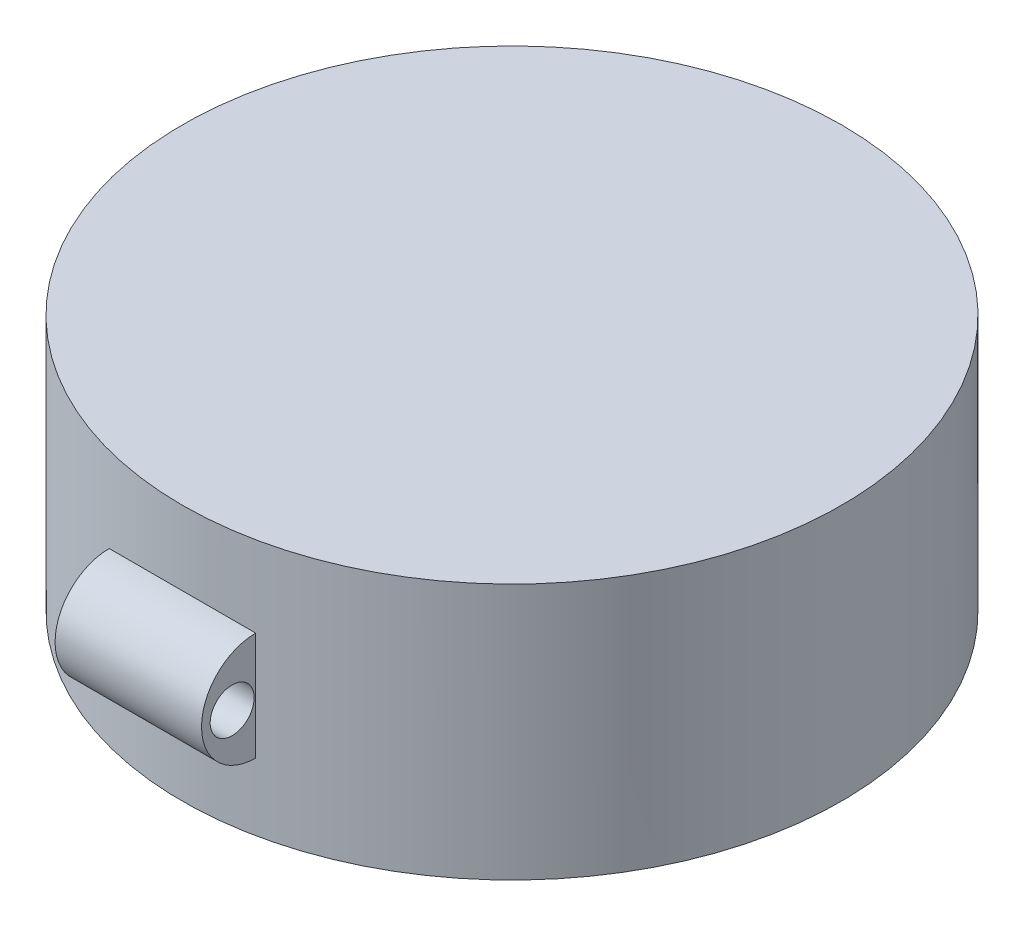
ISO-10303-21;
HEADER;
FILE_DESCRIPTION(('STEP AP214'),'2;1');
FILE_NAME('part.step','',(''),(''),'','','');
FILE_SCHEMA(('AUTOMOTIVE_DESIGN { 1 0 10303 214 1 1 1 1 }'));
ENDSEC;
DATA;
#1=APPLICATION_CONTEXT('core data for automotive mechanical design processes');
#2=APPLICATION_PROTOCOL_DEFINITION('international standard','automotive_design',2000,#1);
#3=PRODUCT_CONTEXT('',#1,'mechanical');
#4=PRODUCT('Part','Part','',(#3));
#5=PRODUCT_RELATED_PRODUCT_CATEGORY('part','',(#4));
#6=PRODUCT_DEFINITION_FORMATION('','',#4);
#7=PRODUCT_DEFINITION_CONTEXT('part definition',#1,'design');
#8=PRODUCT_DEFINITION('design','',#6,#7);
#9=PRODUCT_DEFINITION_SHAPE('','',#8);
#10=(LENGTH_UNIT() NAMED_UNIT(*) SI_UNIT(.MILLI.,.METRE.));
#11=(NAMED_UNIT(*) PLANE_ANGLE_UNIT() SI_UNIT($,.RADIAN.));
#12=(NAMED_UNIT(*) SI_UNIT($,.STERADIAN.) SOLID_ANGLE_UNIT());
#13=UNCERTAINTY_MEASURE_WITH_UNIT(LENGTH_MEASURE(1.E-05),#10,'distance_accuracy_value','');
#14=(GEOMETRIC_REPRESENTATION_CONTEXT(3) GLOBAL_UNCERTAINTY_ASSIGNED_CONTEXT((#13)) GLOBAL_UNIT_ASSIGNED_CONTEXT((#10,
#11,#12)) REPRESENTATION_CONTEXT('',''));
#15=CARTESIAN_POINT('',(0.,0.,0.));
#16=DIRECTION('',(0.,0.,1.));
#17=DIRECTION('',(1.,0.,0.));
#18=AXIS2_PLACEMENT_3D('',#15,#16,#17);
#19=CARTESIAN_POINT('',(10.,2.5,45.));
#20=DIRECTION('',(-1.,0.,0.));
#21=DIRECTION('',(0.,0.,1.));
#22=AXIS2_PLACEMENT_3D('',#19,#20,#21);
#23=CYLINDRICAL_SURFACE('',#22,7.39009012205296);
#24=CARTESIAN_POINT('',(-10.,2.5,45.));
#25=DIRECTION('',(-1.,0.,0.));
#26=DIRECTION('',(0.,0.,1.));
#27=AXIS2_PLACEMENT_3D('',#24,#25,#26);
#28=CIRCLE('',#27,7.39009012205296);
#29=CARTESIAN_POINT('',(-10.,-4.89009012205297,45.));
#30=VERTEX_POINT('',#29);
#31=CARTESIAN_POINT('',(-10.,9.89009012205296,45.));
#32=VERTEX_POINT('',#31);
#33=EDGE_CURVE('E12',#30,#32,#28,.T.);
#34=ORIENTED_EDGE('',*,*,#33,.F.);
#35=DIRECTION('',(-1.,0.,0.));
#36=VECTOR('',#35,1.);
#37=CARTESIAN_POINT('',(10.,-4.89009012205297,45.));
#38=LINE('',#37,#36);
#39=CARTESIAN_POINT('',(10.,-4.89009012205297,45.));
#40=VERTEX_POINT('',#39);
#41=EDGE_CURVE('E76',#40,#30,#38,.T.);
#42=ORIENTED_EDGE('',*,*,#41,.F.);
#43=CARTESIAN_POINT('',(10.,2.5,45.));
#44=DIRECTION('',(-1.,0.,0.));
#45=DIRECTION('',(0.,0.,1.));
#46=AXIS2_PLACEMENT_3D('',#43,#44,#45);
#47=CIRCLE('',#46,7.39009012205296);
#48=CARTESIAN_POINT('',(10.,9.89009012205296,45.));
#49=VERTEX_POINT('',#48);
#50=EDGE_CURVE('E56',#40,#49,#47,.T.);
#51=ORIENTED_EDGE('',*,*,#50,.T.);
#52=DIRECTION('',(-1.,0.,0.));
#53=VECTOR('',#52,1.);
#54=CARTESIAN_POINT('',(10.,9.89009012205296,45.));
#55=LINE('',#54,#53);
#56=EDGE_CURVE('E71',#49,#32,#55,.T.);
#57=ORIENTED_EDGE('',*,*,#56,.T.);
#58=EDGE_LOOP('',(#34,#42,#51,#57));
#59=FACE_BOUND('',#58,.T.);
#60=ADVANCED_FACE('F52',(#59),#23,.T.);
#61=CARTESIAN_POINT('',(10.,9.89009012205296,45.));
#62=DIRECTION('',(0.,0.,-1.));
#63=DIRECTION('',(-1.,0.,0.));
#64=AXIS2_PLACEMENT_3D('',#61,#62,#63);
#65=PLANE('',#64);
#66=DIRECTION('',(0.,-1.,0.));
#67=VECTOR('',#66,1.);
#68=CARTESIAN_POINT('',(-10.,9.89009012205296,45.));
#69=LINE('',#68,#67);
#70=EDGE_CURVE('E62',#32,#30,#69,.T.);
#71=ORIENTED_EDGE('',*,*,#70,.F.);
#72=ORIENTED_EDGE('',*,*,#56,.F.);
#73=DIRECTION('',(0.,-1.,0.));
#74=VECTOR('',#73,1.);
#75=CARTESIAN_POINT('',(10.,9.89009012205296,45.));
#76=LINE('',#75,#74);
#77=EDGE_CURVE('E83',#49,#40,#76,.T.);
#78=ORIENTED_EDGE('',*,*,#77,.T.);
#79=ORIENTED_EDGE('',*,*,#41,.T.);
#80=EDGE_LOOP('',(#71,#72,#78,#79));
#81=FACE_BOUND('',#80,.T.);
#82=ADVANCED_FACE('F81',(#81),#65,.T.);
#83=CARTESIAN_POINT('',(10.,2.5,45.));
#84=DIRECTION('',(-1.,0.,0.));
#85=DIRECTION('',(0.,0.,1.));
#86=AXIS2_PLACEMENT_3D('',#83,#84,#85);
#87=PLANE('',#86);
#88=CARTESIAN_POINT('',(10.,2.36740104397088,48.206917234776));
#89=DIRECTION('',(1.,0.,0.));
#90=DIRECTION('',(0.,0.,-1.));
#91=AXIS2_PLACEMENT_3D('',#88,#89,#90);
#92=CIRCLE('',#91,3.00464708406584);
#93=CARTESIAN_POINT('',(10.,2.36740104397088,45.2022701507102));
#94=VERTEX_POINT('',#93);
#95=EDGE_CURVE('E91',#94,#94,#92,.T.);
#96=ORIENTED_EDGE('',*,*,#95,.F.);
#97=EDGE_LOOP('',(#96));
#98=FACE_BOUND('',#97,.T.);
#99=ORIENTED_EDGE('',*,*,#50,.F.);
#100=ORIENTED_EDGE('',*,*,#77,.F.);
#101=EDGE_LOOP('',(#99,#100));
#102=FACE_BOUND('',#101,.T.);
#103=ADVANCED_FACE('F54',(#98,#102),#87,.F.);
#104=CARTESIAN_POINT('',(-10.,2.5,45.));
#105=DIRECTION('',(-1.,0.,0.));
#106=DIRECTION('',(0.,0.,1.));
#107=AXIS2_PLACEMENT_3D('',#104,#105,#106);
#108=PLANE('',#107);
#109=CARTESIAN_POINT('',(-10.,2.36740104397088,48.206917234776));
#110=DIRECTION('',(1.,0.,0.));
#111=DIRECTION('',(0.,0.,-1.));
#112=AXIS2_PLACEMENT_3D('',#109,#110,#111);
#113=CIRCLE('',#112,3.00464708406584);
#114=CARTESIAN_POINT('',(-10.,2.36740104397088,45.2022701507102));
#115=VERTEX_POINT('',#114);
#116=EDGE_CURVE('E89',#115,#115,#113,.T.);
#117=ORIENTED_EDGE('',*,*,#116,.T.);
#118=EDGE_LOOP('',(#117));
#119=FACE_BOUND('',#118,.T.);
#120=ORIENTED_EDGE('',*,*,#33,.T.);
#121=ORIENTED_EDGE('',*,*,#70,.T.);
#122=EDGE_LOOP('',(#120,#121));
#123=FACE_BOUND('',#122,.T.);
#124=ADVANCED_FACE('F97',(#119,#123),#108,.T.);
#125=CARTESIAN_POINT('',(-10.,2.36740104397088,48.206917234776));
#126=DIRECTION('',(1.,0.,0.));
#127=DIRECTION('',(0.,0.,-1.));
#128=AXIS2_PLACEMENT_3D('',#125,#126,#127);
#129=CYLINDRICAL_SURFACE('',#128,3.00464708406584);
#130=ORIENTED_EDGE('',*,*,#116,.F.);
#131=EDGE_LOOP('',(#130));
#132=FACE_BOUND('',#131,.T.);
#133=ORIENTED_EDGE('',*,*,#95,.T.);
#134=EDGE_LOOP('',(#133));
#135=FACE_BOUND('',#134,.T.);
#136=ADVANCED_FACE('F100',(#132,#135),#129,.F.);
#137=CLOSED_SHELL('',(#60,#82,#103,#124,#136));
#138=MANIFOLD_SOLID_BREP('B2',#137);
#139=CARTESIAN_POINT('',(10.,2.5,-45.));
#140=DIRECTION('',(-1.,0.,0.));
#141=DIRECTION('',(0.,0.,1.));
#142=AXIS2_PLACEMENT_3D('',#139,#140,#141);
#143=CYLINDRICAL_SURFACE('',#142,7.39009012205296);
#144=CARTESIAN_POINT('',(-10.,2.5,-45.));
#145=DIRECTION('',(1.,0.,0.));
#146=DIRECTION('',(0.,0.,-1.));
#147=AXIS2_PLACEMENT_3D('',#144,#145,#146);
#148=CIRCLE('',#147,7.39009012205296);
#149=CARTESIAN_POINT('',(-10.,-4.89009012205297,-45.));
#150=VERTEX_POINT('',#149);
#151=CARTESIAN_POINT('',(-10.,9.89009012205296,-45.));
#152=VERTEX_POINT('',#151);
#153=EDGE_CURVE('E183',#150,#152,#148,.T.);
#154=ORIENTED_EDGE('',*,*,#153,.T.);
#155=DIRECTION('',(-1.,0.,0.));
#156=VECTOR('',#155,1.);
#157=CARTESIAN_POINT('',(10.,9.89009012205296,-45.));
#158=LINE('',#157,#156);
#159=CARTESIAN_POINT('',(10.,9.89009012205296,-45.));
#160=VERTEX_POINT('',#159);
#161=EDGE_CURVE('E50',#160,#152,#158,.T.);
#162=ORIENTED_EDGE('',*,*,#161,.F.);
#163=CARTESIAN_POINT('',(10.,2.5,-45.));
#164=DIRECTION('',(1.,0.,0.));
#165=DIRECTION('',(0.,0.,-1.));
#166=AXIS2_PLACEMENT_3D('',#163,#164,#165);
#167=CIRCLE('',#166,7.39009012205296);
#168=CARTESIAN_POINT('',(10.,-4.89009012205297,-45.));
#169=VERTEX_POINT('',#168);
#170=EDGE_CURVE('E182',#169,#160,#167,.T.);
#171=ORIENTED_EDGE('',*,*,#170,.F.);
#172=DIRECTION('',(-1.,0.,0.));
#173=VECTOR('',#172,1.);
#174=CARTESIAN_POINT('',(10.,-4.89009012205297,-45.));
#175=LINE('',#174,#173);
#176=EDGE_CURVE('E160',#169,#150,#175,.T.);
#177=ORIENTED_EDGE('',*,*,#176,.T.);
#178=EDGE_LOOP('',(#154,#162,#171,#177));
#179=FACE_BOUND('',#178,.T.);
#180=ADVANCED_FACE('F152',(#179),#143,.T.);
#181=CARTESIAN_POINT('',(10.,9.89009012205296,-45.));
#182=DIRECTION('',(0.,0.,-1.));
#183=DIRECTION('',(-1.,0.,0.));
#184=AXIS2_PLACEMENT_3D('',#181,#182,#183);
#185=PLANE('',#184);
#186=DIRECTION('',(0.,-1.,0.));
#187=VECTOR('',#186,1.);
#188=CARTESIAN_POINT('',(-10.,9.89009012205296,-45.));
#189=LINE('',#188,#187);
#190=EDGE_CURVE('E175',#152,#150,#189,.T.);
#191=ORIENTED_EDGE('',*,*,#190,.T.);
#192=ORIENTED_EDGE('',*,*,#176,.F.);
#193=DIRECTION('',(0.,-1.,0.));
#194=VECTOR('',#193,1.);
#195=CARTESIAN_POINT('',(10.,9.89009012205296,-45.));
#196=LINE('',#195,#194);
#197=EDGE_CURVE('E167',#160,#169,#196,.T.);
#198=ORIENTED_EDGE('',*,*,#197,.F.);
#199=ORIENTED_EDGE('',*,*,#161,.T.);
#200=EDGE_LOOP('',(#191,#192,#198,#199));
#201=FACE_BOUND('',#200,.T.);
#202=ADVANCED_FACE('F178',(#201),#185,.F.);
#203=CARTESIAN_POINT('',(10.,2.5,-45.));
#204=DIRECTION('',(1.,0.,0.));
#205=DIRECTION('',(0.,0.,-1.));
#206=AXIS2_PLACEMENT_3D('',#203,#204,#205);
#207=PLANE('',#206);
#208=CARTESIAN_POINT('',(10.,2.36740104397088,-48.206917234776));
#209=DIRECTION('',(1.,0.,0.));
#210=DIRECTION('',(0.,0.,1.));
#211=AXIS2_PLACEMENT_3D('',#208,#209,#210);
#212=CIRCLE('',#211,3.00464708406584);
#213=CARTESIAN_POINT('',(10.,2.36740104397088,-45.2022701507102));
#214=VERTEX_POINT('',#213);
#215=EDGE_CURVE('E190',#214,#214,#212,.T.);
#216=ORIENTED_EDGE('',*,*,#215,.F.);
#217=EDGE_LOOP('',(#216));
#218=FACE_BOUND('',#217,.T.);
#219=ORIENTED_EDGE('',*,*,#170,.T.);
#220=ORIENTED_EDGE('',*,*,#197,.T.);
#221=EDGE_LOOP('',(#219,#220));
#222=FACE_BOUND('',#221,.T.);
#223=ADVANCED_FACE('F200',(#218,#222),#207,.T.);
#224=CARTESIAN_POINT('',(-10.,2.5,-45.));
#225=DIRECTION('',(1.,0.,0.));
#226=DIRECTION('',(0.,0.,-1.));
#227=AXIS2_PLACEMENT_3D('',#224,#225,#226);
#228=PLANE('',#227);
#229=CARTESIAN_POINT('',(-10.,2.36740104397088,-48.206917234776));
#230=DIRECTION('',(1.,0.,0.));
#231=DIRECTION('',(0.,0.,1.));
#232=AXIS2_PLACEMENT_3D('',#229,#230,#231);
#233=CIRCLE('',#232,3.00464708406584);
#234=CARTESIAN_POINT('',(-10.,2.36740104397088,-45.2022701507102));
#235=VERTEX_POINT('',#234);
#236=EDGE_CURVE('E187',#235,#235,#233,.T.);
#237=ORIENTED_EDGE('',*,*,#236,.T.);
#238=EDGE_LOOP('',(#237));
#239=FACE_BOUND('',#238,.T.);
#240=ORIENTED_EDGE('',*,*,#153,.F.);
#241=ORIENTED_EDGE('',*,*,#190,.F.);
#242=EDGE_LOOP('',(#240,#241));
#243=FACE_BOUND('',#242,.T.);
#244=ADVANCED_FACE('F186',(#239,#243),#228,.F.);
#245=CARTESIAN_POINT('',(-10.,2.36740104397088,-48.206917234776));
#246=DIRECTION('',(1.,0.,0.));
#247=DIRECTION('',(0.,0.,-1.));
#248=AXIS2_PLACEMENT_3D('',#245,#246,#247);
#249=CYLINDRICAL_SURFACE('',#248,3.00464708406584);
#250=ORIENTED_EDGE('',*,*,#236,.F.);
#251=EDGE_LOOP('',(#250));
#252=FACE_BOUND('',#251,.T.);
#253=ORIENTED_EDGE('',*,*,#215,.T.);
#254=EDGE_LOOP('',(#253));
#255=FACE_BOUND('',#254,.T.);
#256=ADVANCED_FACE('F198',(#252,#255),#249,.F.);
#257=CLOSED_SHELL('',(#180,#202,#223,#244,#256));
#258=MANIFOLD_SOLID_BREP('B6',#257);
#259=CARTESIAN_POINT('',(0.,20.,0.));
#260=DIRECTION('',(0.,-1.,0.));
#261=DIRECTION('',(0.,0.,-1.));
#262=AXIS2_PLACEMENT_3D('',#259,#260,#261);
#263=CYLINDRICAL_SURFACE('',#262,45.);
#264=CARTESIAN_POINT('',(0.,20.,0.));
#265=DIRECTION('',(0.,1.,0.));
#266=DIRECTION('',(0.,0.,1.));
#267=AXIS2_PLACEMENT_3D('',#264,#265,#266);
#268=CIRCLE('',#267,45.);
#269=CARTESIAN_POINT('',(0.,20.,45.));
#270=VERTEX_POINT('',#269);
#271=EDGE_CURVE('E151',#270,#270,#268,.T.);
#272=ORIENTED_EDGE('',*,*,#271,.F.);
#273=EDGE_LOOP('',(#272));
#274=FACE_BOUND('',#273,.T.);
#275=CARTESIAN_POINT('',(0.,-15.,0.));
#276=DIRECTION('',(0.,-1.,0.));
#277=DIRECTION('',(0.,0.,-1.));
#278=AXIS2_PLACEMENT_3D('',#275,#276,#277);
#279=CIRCLE('',#278,45.);
#280=CARTESIAN_POINT('',(0.,-15.,-45.));
#281=VERTEX_POINT('',#280);
#282=EDGE_CURVE('E252',#281,#281,#279,.T.);
#283=ORIENTED_EDGE('',*,*,#282,.F.);
#284=EDGE_LOOP('',(#283));
#285=FACE_BOUND('',#284,.T.);
#286=ADVANCED_FACE('F245',(#274,#285),#263,.T.);
#287=CARTESIAN_POINT('',(0.,20.,0.));
#288=DIRECTION('',(0.,1.,0.));
#289=DIRECTION('',(0.,0.,1.));
#290=AXIS2_PLACEMENT_3D('',#287,#288,#289);
#291=PLANE('',#290);
#292=ORIENTED_EDGE('',*,*,#271,.T.);
#293=EDGE_LOOP('',(#292));
#294=FACE_BOUND('',#293,.T.);
#295=ADVANCED_FACE('F262',(#294),#291,.T.);
#296=CARTESIAN_POINT('',(0.,-15.,0.));
#297=DIRECTION('',(0.,-1.,0.));
#298=DIRECTION('',(0.,0.,-1.));
#299=AXIS2_PLACEMENT_3D('',#296,#297,#298);
#300=PLANE('',#299);
#301=ORIENTED_EDGE('',*,*,#282,.T.);
#302=EDGE_LOOP('',(#301));
#303=FACE_BOUND('',#302,.T.);
#304=ADVANCED_FACE('F259',(#303),#300,.T.);
#305=CLOSED_SHELL('',(#286,#295,#304));
#306=MANIFOLD_SOLID_BREP('B44',#305);
#307=ADVANCED_BREP_SHAPE_REPRESENTATION('',(#18,#138,#258,#306),#14);
#308=SHAPE_DEFINITION_REPRESENTATION(#9,#307);
ENDSEC;
END-ISO-10303-21;
